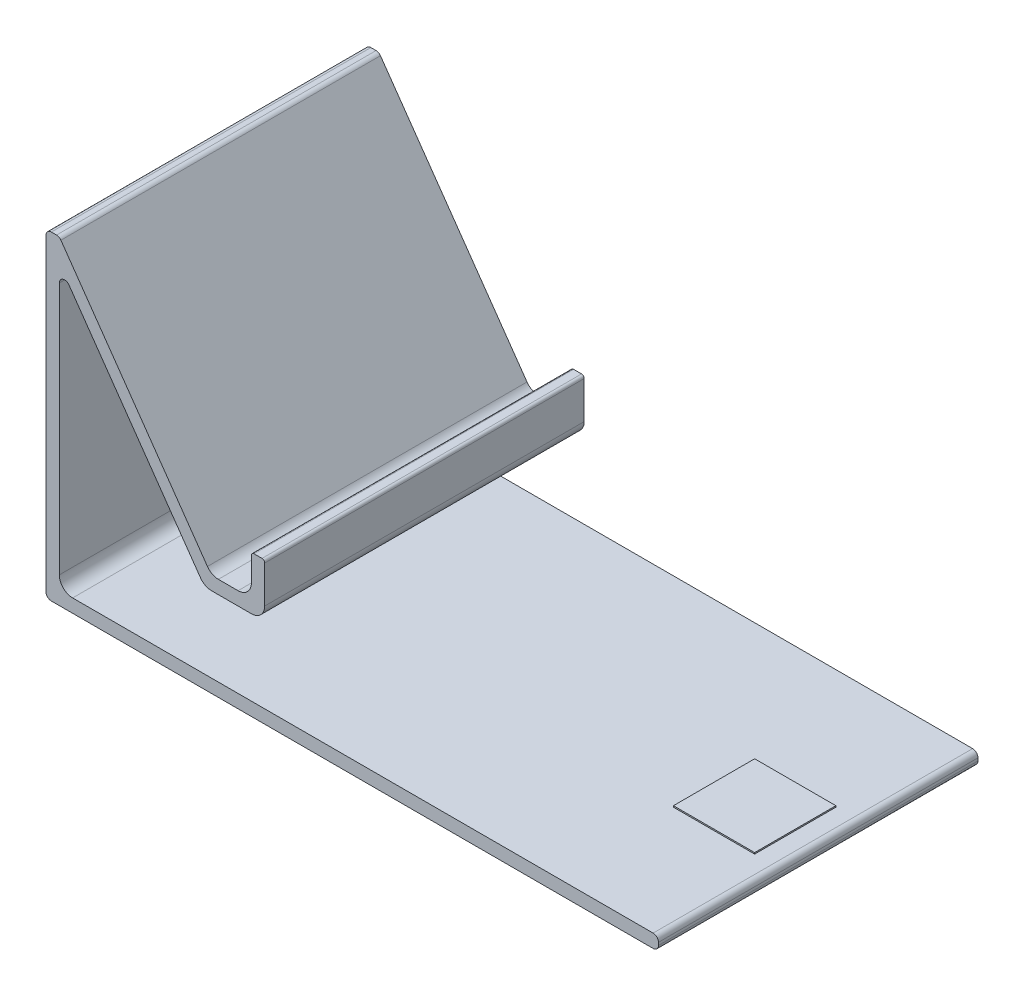
ISO-10303-21;
HEADER;
FILE_DESCRIPTION(('STEP AP214'),'2;1');
FILE_NAME('part.step','',(''),(''),'','','');
FILE_SCHEMA(('AUTOMOTIVE_DESIGN { 1 0 10303 214 1 1 1 1 }'));
ENDSEC;
DATA;
#1=APPLICATION_CONTEXT('core data for automotive mechanical design processes');
#2=APPLICATION_PROTOCOL_DEFINITION('international standard','automotive_design',2000,#1);
#3=PRODUCT_CONTEXT('',#1,'mechanical');
#4=PRODUCT('Part','Part','',(#3));
#5=PRODUCT_RELATED_PRODUCT_CATEGORY('part','',(#4));
#6=PRODUCT_DEFINITION_FORMATION('','',#4);
#7=PRODUCT_DEFINITION_CONTEXT('part definition',#1,'design');
#8=PRODUCT_DEFINITION('design','',#6,#7);
#9=PRODUCT_DEFINITION_SHAPE('','',#8);
#10=(LENGTH_UNIT() NAMED_UNIT(*) SI_UNIT(.MILLI.,.METRE.));
#11=(NAMED_UNIT(*) PLANE_ANGLE_UNIT() SI_UNIT($,.RADIAN.));
#12=(NAMED_UNIT(*) SI_UNIT($,.STERADIAN.) SOLID_ANGLE_UNIT());
#13=UNCERTAINTY_MEASURE_WITH_UNIT(LENGTH_MEASURE(1.E-05),#10,'distance_accuracy_value','');
#14=(GEOMETRIC_REPRESENTATION_CONTEXT(3) GLOBAL_UNCERTAINTY_ASSIGNED_CONTEXT((#13)) GLOBAL_UNIT_ASSIGNED_CONTEXT((#10,
#11,#12)) REPRESENTATION_CONTEXT('',''));
#15=CARTESIAN_POINT('',(0.,0.,0.));
#16=DIRECTION('',(0.,0.,1.));
#17=DIRECTION('',(1.,0.,0.));
#18=AXIS2_PLACEMENT_3D('',#15,#16,#17);
#19=CARTESIAN_POINT('',(228.,5.,120.));
#20=DIRECTION('',(0.,-1.,0.));
#21=DIRECTION('',(1.,0.,0.));
#22=AXIS2_PLACEMENT_3D('',#19,#20,#21);
#23=PLANE('',#22);
#24=DIRECTION('',(-1.,0.,0.));
#25=VECTOR('',#24,1.);
#26=CARTESIAN_POINT('',(228.,5.,0.));
#27=LINE('',#26,#25);
#28=CARTESIAN_POINT('',(228.,5.,0.));
#29=VERTEX_POINT('',#28);
#30=CARTESIAN_POINT('',(10.,4.99999999999997,0.));
#31=VERTEX_POINT('',#30);
#32=EDGE_CURVE('E339',#29,#31,#27,.T.);
#33=ORIENTED_EDGE('',*,*,#32,.T.);
#34=DIRECTION('',(0.,0.,-1.));
#35=VECTOR('',#34,1.);
#36=CARTESIAN_POINT('',(10.,4.99999999999997,120.));
#37=LINE('',#36,#35);
#38=CARTESIAN_POINT('',(10.,4.99999999999997,120.));
#39=VERTEX_POINT('',#38);
#40=EDGE_CURVE('E409',#39,#31,#37,.T.);
#41=ORIENTED_EDGE('',*,*,#40,.F.);
#42=DIRECTION('',(-1.,0.,0.));
#43=VECTOR('',#42,1.);
#44=CARTESIAN_POINT('',(228.,5.,120.));
#45=LINE('',#44,#43);
#46=CARTESIAN_POINT('',(228.,5.,120.));
#47=VERTEX_POINT('',#46);
#48=EDGE_CURVE('E284',#47,#39,#45,.T.);
#49=ORIENTED_EDGE('',*,*,#48,.F.);
#50=DIRECTION('',(0.,0.,-1.));
#51=VECTOR('',#50,1.);
#52=CARTESIAN_POINT('',(228.,5.,120.));
#53=LINE('',#52,#51);
#54=EDGE_CURVE('E412',#47,#29,#53,.T.);
#55=ORIENTED_EDGE('',*,*,#54,.T.);
#56=EDGE_LOOP('',(#33,#41,#49,#55));
#57=FACE_BOUND('',#56,.T.);
#58=DIRECTION('',(0.,0.,1.));
#59=VECTOR('',#58,1.);
#60=CARTESIAN_POINT('',(190.874109235652,4.99999999999999,120.));
#61=LINE('',#60,#59);
#62=CARTESIAN_POINT('',(190.874109235652,5.,44.75));
#63=VERTEX_POINT('',#62);
#64=CARTESIAN_POINT('',(190.874109235652,4.99999999999999,75.25));
#65=VERTEX_POINT('',#64);
#66=EDGE_CURVE('E11',#63,#65,#61,.T.);
#67=ORIENTED_EDGE('',*,*,#66,.F.);
#68=DIRECTION('',(-1.,0.,0.));
#69=VECTOR('',#68,1.);
#70=CARTESIAN_POINT('',(228.,5.,44.75));
#71=LINE('',#70,#69);
#72=CARTESIAN_POINT('',(221.374109235652,5.,44.75));
#73=VERTEX_POINT('',#72);
#74=EDGE_CURVE('E440',#73,#63,#71,.T.);
#75=ORIENTED_EDGE('',*,*,#74,.F.);
#76=DIRECTION('',(0.,0.,-1.));
#77=VECTOR('',#76,1.);
#78=CARTESIAN_POINT('',(221.374109235652,5.,120.));
#79=LINE('',#78,#77);
#80=CARTESIAN_POINT('',(221.374109235652,5.,75.25));
#81=VERTEX_POINT('',#80);
#82=EDGE_CURVE('E51',#81,#73,#79,.T.);
#83=ORIENTED_EDGE('',*,*,#82,.F.);
#84=DIRECTION('',(1.,0.,0.));
#85=VECTOR('',#84,1.);
#86=CARTESIAN_POINT('',(228.,5.,75.25));
#87=LINE('',#86,#85);
#88=EDGE_CURVE('E41',#65,#81,#87,.T.);
#89=ORIENTED_EDGE('',*,*,#88,.F.);
#90=EDGE_LOOP('',(#67,#75,#83,#89));
#91=FACE_BOUND('',#90,.T.);
#92=ADVANCED_FACE('F33',(#57,#91),#23,.F.);
#93=CARTESIAN_POINT('',(64.726944488411,43.4183172581834,120.));
#94=DIRECTION('',(0.,0.,-1.));
#95=DIRECTION('',(-1.,0.,0.));
#96=AXIS2_PLACEMENT_3D('',#93,#94,#95);
#97=CYLINDRICAL_SURFACE('',#96,5.);
#98=CARTESIAN_POINT('',(64.726944488411,43.4183172581834,0.));
#99=DIRECTION('',(0.,0.,-1.));
#100=DIRECTION('',(-1.,0.,0.));
#101=AXIS2_PLACEMENT_3D('',#98,#99,#100);
#102=CIRCLE('',#101,5.);
#103=CARTESIAN_POINT('',(64.7269444884111,38.4183172581834,0.));
#104=VERTEX_POINT('',#103);
#105=CARTESIAN_POINT('',(60.6311842669661,40.5504350764282,0.));
#106=VERTEX_POINT('',#105);
#107=EDGE_CURVE('E247',#104,#106,#102,.T.);
#108=ORIENTED_EDGE('',*,*,#107,.T.);
#109=DIRECTION('',(0.,0.,-1.));
#110=VECTOR('',#109,1.);
#111=CARTESIAN_POINT('',(60.6311842669661,40.5504350764282,120.));
#112=LINE('',#111,#110);
#113=CARTESIAN_POINT('',(60.6311842669661,40.5504350764282,120.));
#114=VERTEX_POINT('',#113);
#115=EDGE_CURVE('E437',#114,#106,#112,.T.);
#116=ORIENTED_EDGE('',*,*,#115,.F.);
#117=CARTESIAN_POINT('',(64.726944488411,43.4183172581834,120.));
#118=DIRECTION('',(0.,0.,-1.));
#119=DIRECTION('',(-1.,0.,0.));
#120=AXIS2_PLACEMENT_3D('',#117,#118,#119);
#121=CIRCLE('',#120,5.);
#122=CARTESIAN_POINT('',(64.7269444884111,38.4183172581834,120.));
#123=VERTEX_POINT('',#122);
#124=EDGE_CURVE('E256',#123,#114,#121,.T.);
#125=ORIENTED_EDGE('',*,*,#124,.F.);
#126=DIRECTION('',(0.,0.,-1.));
#127=VECTOR('',#126,1.);
#128=CARTESIAN_POINT('',(64.7269444884111,38.4183172581834,120.));
#129=LINE('',#128,#127);
#130=EDGE_CURVE('E313',#123,#104,#129,.T.);
#131=ORIENTED_EDGE('',*,*,#130,.T.);
#132=EDGE_LOOP('',(#108,#116,#125,#131));
#133=FACE_BOUND('',#132,.T.);
#134=ADVANCED_FACE('F35',(#133),#97,.F.);
#135=CARTESIAN_POINT('',(60.6311842669661,40.5504350764282,120.));
#136=DIRECTION('',(-0.819152044288995,-0.573576436351042,0.));
#137=DIRECTION('',(0.573576436351042,-0.819152044288995,0.));
#138=AXIS2_PLACEMENT_3D('',#135,#136,#137);
#139=PLANE('',#138);
#140=DIRECTION('',(-0.573576436351042,0.819152044288995,0.));
#141=VECTOR('',#140,1.);
#142=CARTESIAN_POINT('',(60.6311842669661,40.5504350764282,0.));
#143=LINE('',#142,#141);
#144=CARTESIAN_POINT('',(5.5971699874745,119.147152872702,0.));
#145=VERTEX_POINT('',#144);
#146=EDGE_CURVE('E250',#106,#145,#143,.T.);
#147=ORIENTED_EDGE('',*,*,#146,.T.);
#148=DIRECTION('',(0.,0.,-1.));
#149=VECTOR('',#148,1.);
#150=CARTESIAN_POINT('',(5.5971699874745,119.147152872702,120.));
#151=LINE('',#150,#149);
#152=CARTESIAN_POINT('',(5.5971699874745,119.147152872702,120.));
#153=VERTEX_POINT('',#152);
#154=EDGE_CURVE('E434',#153,#145,#151,.T.);
#155=ORIENTED_EDGE('',*,*,#154,.F.);
#156=DIRECTION('',(-0.573576436351042,0.819152044288995,0.));
#157=VECTOR('',#156,1.);
#158=CARTESIAN_POINT('',(60.6311842669661,40.5504350764282,120.));
#159=LINE('',#158,#157);
#160=EDGE_CURVE('E259',#114,#153,#159,.T.);
#161=ORIENTED_EDGE('',*,*,#160,.F.);
#162=ORIENTED_EDGE('',*,*,#115,.T.);
#163=EDGE_LOOP('',(#147,#155,#161,#162));
#164=FACE_BOUND('',#163,.T.);
#165=ADVANCED_FACE('F459',(#164),#139,.F.);
#166=CARTESIAN_POINT('',(3.9588658988965,118.,120.));
#167=DIRECTION('',(0.,0.,-1.));
#168=DIRECTION('',(-1.,0.,0.));
#169=AXIS2_PLACEMENT_3D('',#166,#167,#168);
#170=CYLINDRICAL_SURFACE('',#169,2.);
#171=CARTESIAN_POINT('',(3.9588658988965,118.,0.));
#172=DIRECTION('',(0.,0.,1.));
#173=DIRECTION('',(1.,0.,0.));
#174=AXIS2_PLACEMENT_3D('',#171,#172,#173);
#175=CIRCLE('',#174,2.);
#176=CARTESIAN_POINT('',(3.95886589889649,120.,0.));
#177=VERTEX_POINT('',#176);
#178=EDGE_CURVE('E316',#145,#177,#175,.T.);
#179=ORIENTED_EDGE('',*,*,#178,.T.);
#180=DIRECTION('',(0.,0.,-1.));
#181=VECTOR('',#180,1.);
#182=CARTESIAN_POINT('',(3.95886589889649,120.,120.));
#183=LINE('',#182,#181);
#184=CARTESIAN_POINT('',(3.95886589889649,120.,120.));
#185=VERTEX_POINT('',#184);
#186=EDGE_CURVE('E432',#185,#177,#183,.T.);
#187=ORIENTED_EDGE('',*,*,#186,.F.);
#188=CARTESIAN_POINT('',(3.9588658988965,118.,120.));
#189=DIRECTION('',(0.,0.,1.));
#190=DIRECTION('',(1.,0.,0.));
#191=AXIS2_PLACEMENT_3D('',#188,#189,#190);
#192=CIRCLE('',#191,2.);
#193=EDGE_CURVE('E262',#153,#185,#192,.T.);
#194=ORIENTED_EDGE('',*,*,#193,.F.);
#195=ORIENTED_EDGE('',*,*,#154,.T.);
#196=EDGE_LOOP('',(#179,#187,#194,#195));
#197=FACE_BOUND('',#196,.T.);
#198=ADVANCED_FACE('F496',(#197),#170,.T.);
#199=CARTESIAN_POINT('',(2.00000000000001,120.,120.));
#200=DIRECTION('',(0.,1.,0.));
#201=DIRECTION('',(0.,0.,1.));
#202=AXIS2_PLACEMENT_3D('',#199,#200,#201);
#203=PLANE('',#202);
#204=DIRECTION('',(1.,0.,0.));
#205=VECTOR('',#204,1.);
#206=CARTESIAN_POINT('',(2.00000000000001,120.,0.));
#207=LINE('',#206,#205);
#208=CARTESIAN_POINT('',(2.00000000000001,120.,0.));
#209=VERTEX_POINT('',#208);
#210=EDGE_CURVE('E319',#209,#177,#207,.T.);
#211=ORIENTED_EDGE('',*,*,#210,.F.);
#212=DIRECTION('',(0.,0.,-1.));
#213=VECTOR('',#212,1.);
#214=CARTESIAN_POINT('',(2.00000000000001,120.,120.));
#215=LINE('',#214,#213);
#216=CARTESIAN_POINT('',(2.00000000000001,120.,120.));
#217=VERTEX_POINT('',#216);
#218=EDGE_CURVE('E430',#217,#209,#215,.T.);
#219=ORIENTED_EDGE('',*,*,#218,.F.);
#220=DIRECTION('',(1.,0.,0.));
#221=VECTOR('',#220,1.);
#222=CARTESIAN_POINT('',(2.00000000000001,120.,120.));
#223=LINE('',#222,#221);
#224=EDGE_CURVE('E264',#217,#185,#223,.T.);
#225=ORIENTED_EDGE('',*,*,#224,.T.);
#226=ORIENTED_EDGE('',*,*,#186,.T.);
#227=EDGE_LOOP('',(#211,#219,#225,#226));
#228=FACE_BOUND('',#227,.T.);
#229=ADVANCED_FACE('F492',(#228),#203,.T.);
#230=CARTESIAN_POINT('',(2.,118.,120.));
#231=DIRECTION('',(0.,0.,-1.));
#232=DIRECTION('',(-1.,0.,0.));
#233=AXIS2_PLACEMENT_3D('',#230,#231,#232);
#234=CYLINDRICAL_SURFACE('',#233,2.);
#235=CARTESIAN_POINT('',(2.,118.,0.));
#236=DIRECTION('',(0.,0.,-1.));
#237=DIRECTION('',(-1.,0.,0.));
#238=AXIS2_PLACEMENT_3D('',#235,#236,#237);
#239=CIRCLE('',#238,2.);
#240=CARTESIAN_POINT('',(0.,118.,0.));
#241=VERTEX_POINT('',#240);
#242=EDGE_CURVE('E322',#241,#209,#239,.T.);
#243=ORIENTED_EDGE('',*,*,#242,.F.);
#244=DIRECTION('',(0.,0.,-1.));
#245=VECTOR('',#244,1.);
#246=CARTESIAN_POINT('',(0.,118.,120.));
#247=LINE('',#246,#245);
#248=CARTESIAN_POINT('',(0.,118.,120.));
#249=VERTEX_POINT('',#248);
#250=EDGE_CURVE('E428',#249,#241,#247,.T.);
#251=ORIENTED_EDGE('',*,*,#250,.F.);
#252=CARTESIAN_POINT('',(2.,118.,120.));
#253=DIRECTION('',(0.,0.,-1.));
#254=DIRECTION('',(-1.,0.,0.));
#255=AXIS2_PLACEMENT_3D('',#252,#253,#254);
#256=CIRCLE('',#255,2.);
#257=EDGE_CURVE('E267',#249,#217,#256,.T.);
#258=ORIENTED_EDGE('',*,*,#257,.T.);
#259=ORIENTED_EDGE('',*,*,#218,.T.);
#260=EDGE_LOOP('',(#243,#251,#258,#259));
#261=FACE_BOUND('',#260,.T.);
#262=ADVANCED_FACE('F488',(#261),#234,.T.);
#263=CARTESIAN_POINT('',(0.,2.00000000000001,120.));
#264=DIRECTION('',(-1.,0.,0.));
#265=DIRECTION('',(0.,0.,1.));
#266=AXIS2_PLACEMENT_3D('',#263,#264,#265);
#267=PLANE('',#266);
#268=DIRECTION('',(0.,1.,0.));
#269=VECTOR('',#268,1.);
#270=CARTESIAN_POINT('',(0.,2.00000000000001,0.));
#271=LINE('',#270,#269);
#272=CARTESIAN_POINT('',(0.,2.00000000000001,0.));
#273=VERTEX_POINT('',#272);
#274=EDGE_CURVE('E325',#273,#241,#271,.T.);
#275=ORIENTED_EDGE('',*,*,#274,.F.);
#276=DIRECTION('',(0.,0.,-1.));
#277=VECTOR('',#276,1.);
#278=CARTESIAN_POINT('',(0.,2.00000000000001,120.));
#279=LINE('',#278,#277);
#280=CARTESIAN_POINT('',(0.,2.00000000000001,120.));
#281=VERTEX_POINT('',#280);
#282=EDGE_CURVE('E426',#281,#273,#279,.T.);
#283=ORIENTED_EDGE('',*,*,#282,.F.);
#284=DIRECTION('',(0.,1.,0.));
#285=VECTOR('',#284,1.);
#286=CARTESIAN_POINT('',(0.,2.00000000000001,120.));
#287=LINE('',#286,#285);
#288=EDGE_CURVE('E270',#281,#249,#287,.T.);
#289=ORIENTED_EDGE('',*,*,#288,.T.);
#290=ORIENTED_EDGE('',*,*,#250,.T.);
#291=EDGE_LOOP('',(#275,#283,#289,#290));
#292=FACE_BOUND('',#291,.T.);
#293=ADVANCED_FACE('F484',(#292),#267,.T.);
#294=CARTESIAN_POINT('',(2.,2.,120.));
#295=DIRECTION('',(0.,0.,-1.));
#296=DIRECTION('',(-1.,0.,0.));
#297=AXIS2_PLACEMENT_3D('',#294,#295,#296);
#298=CYLINDRICAL_SURFACE('',#297,2.);
#299=CARTESIAN_POINT('',(2.,2.,0.));
#300=DIRECTION('',(0.,0.,-1.));
#301=DIRECTION('',(-1.,0.,0.));
#302=AXIS2_PLACEMENT_3D('',#299,#300,#301);
#303=CIRCLE('',#302,2.);
#304=CARTESIAN_POINT('',(2.00000000000001,0.,0.));
#305=VERTEX_POINT('',#304);
#306=EDGE_CURVE('E328',#305,#273,#303,.T.);
#307=ORIENTED_EDGE('',*,*,#306,.F.);
#308=DIRECTION('',(0.,0.,-1.));
#309=VECTOR('',#308,1.);
#310=CARTESIAN_POINT('',(2.00000000000001,0.,120.));
#311=LINE('',#310,#309);
#312=CARTESIAN_POINT('',(2.00000000000001,0.,120.));
#313=VERTEX_POINT('',#312);
#314=EDGE_CURVE('E424',#313,#305,#311,.T.);
#315=ORIENTED_EDGE('',*,*,#314,.F.);
#316=CARTESIAN_POINT('',(2.,2.,120.));
#317=DIRECTION('',(0.,0.,-1.));
#318=DIRECTION('',(-1.,0.,0.));
#319=AXIS2_PLACEMENT_3D('',#316,#317,#318);
#320=CIRCLE('',#319,2.);
#321=EDGE_CURVE('E273',#313,#281,#320,.T.);
#322=ORIENTED_EDGE('',*,*,#321,.T.);
#323=ORIENTED_EDGE('',*,*,#282,.T.);
#324=EDGE_LOOP('',(#307,#315,#322,#323));
#325=FACE_BOUND('',#324,.T.);
#326=ADVANCED_FACE('F480',(#325),#298,.T.);
#327=CARTESIAN_POINT('',(2.00000000000001,0.,120.));
#328=DIRECTION('',(0.,1.,0.));
#329=DIRECTION('',(0.,0.,1.));
#330=AXIS2_PLACEMENT_3D('',#327,#328,#329);
#331=PLANE('',#330);
#332=DIRECTION('',(1.,0.,0.));
#333=VECTOR('',#332,1.);
#334=CARTESIAN_POINT('',(2.00000000000001,0.,0.));
#335=LINE('',#334,#333);
#336=CARTESIAN_POINT('',(228.,0.,0.));
#337=VERTEX_POINT('',#336);
#338=EDGE_CURVE('E331',#305,#337,#335,.T.);
#339=ORIENTED_EDGE('',*,*,#338,.T.);
#340=DIRECTION('',(0.,0.,-1.));
#341=VECTOR('',#340,1.);
#342=CARTESIAN_POINT('',(228.,0.,120.));
#343=LINE('',#342,#341);
#344=CARTESIAN_POINT('',(228.,0.,120.));
#345=VERTEX_POINT('',#344);
#346=EDGE_CURVE('E421',#345,#337,#343,.T.);
#347=ORIENTED_EDGE('',*,*,#346,.F.);
#348=DIRECTION('',(1.,0.,0.));
#349=VECTOR('',#348,1.);
#350=CARTESIAN_POINT('',(2.00000000000001,0.,120.));
#351=LINE('',#350,#349);
#352=EDGE_CURVE('E276',#313,#345,#351,.T.);
#353=ORIENTED_EDGE('',*,*,#352,.F.);
#354=ORIENTED_EDGE('',*,*,#314,.T.);
#355=EDGE_LOOP('',(#339,#347,#353,#354));
#356=FACE_BOUND('',#355,.T.);
#357=ADVANCED_FACE('F476',(#356),#331,.F.);
#358=CARTESIAN_POINT('',(228.,2.,120.));
#359=DIRECTION('',(0.,0.,-1.));
#360=DIRECTION('',(-1.,0.,0.));
#361=AXIS2_PLACEMENT_3D('',#358,#359,#360);
#362=CYLINDRICAL_SURFACE('',#361,2.);
#363=CARTESIAN_POINT('',(228.,2.,0.));
#364=DIRECTION('',(0.,0.,1.));
#365=DIRECTION('',(1.,0.,0.));
#366=AXIS2_PLACEMENT_3D('',#363,#364,#365);
#367=CIRCLE('',#366,2.);
#368=CARTESIAN_POINT('',(230.,2.,0.));
#369=VERTEX_POINT('',#368);
#370=EDGE_CURVE('E333',#337,#369,#367,.T.);
#371=ORIENTED_EDGE('',*,*,#370,.T.);
#372=DIRECTION('',(0.,0.,-1.));
#373=VECTOR('',#372,1.);
#374=CARTESIAN_POINT('',(230.,2.,120.));
#375=LINE('',#374,#373);
#376=CARTESIAN_POINT('',(230.,2.,120.));
#377=VERTEX_POINT('',#376);
#378=EDGE_CURVE('E418',#377,#369,#375,.T.);
#379=ORIENTED_EDGE('',*,*,#378,.F.);
#380=CARTESIAN_POINT('',(228.,2.,120.));
#381=DIRECTION('',(0.,0.,1.));
#382=DIRECTION('',(1.,0.,0.));
#383=AXIS2_PLACEMENT_3D('',#380,#381,#382);
#384=CIRCLE('',#383,2.);
#385=EDGE_CURVE('E278',#345,#377,#384,.T.);
#386=ORIENTED_EDGE('',*,*,#385,.F.);
#387=ORIENTED_EDGE('',*,*,#346,.T.);
#388=EDGE_LOOP('',(#371,#379,#386,#387));
#389=FACE_BOUND('',#388,.T.);
#390=ADVANCED_FACE('F472',(#389),#362,.T.);
#391=CARTESIAN_POINT('',(230.,2.,120.));
#392=DIRECTION('',(-1.,0.,0.));
#393=DIRECTION('',(0.,0.,1.));
#394=AXIS2_PLACEMENT_3D('',#391,#392,#393);
#395=PLANE('',#394);
#396=DIRECTION('',(0.,1.,0.));
#397=VECTOR('',#396,1.);
#398=CARTESIAN_POINT('',(230.,2.,0.));
#399=LINE('',#398,#397);
#400=CARTESIAN_POINT('',(230.,3.,0.));
#401=VERTEX_POINT('',#400);
#402=EDGE_CURVE('E335',#369,#401,#399,.T.);
#403=ORIENTED_EDGE('',*,*,#402,.T.);
#404=DIRECTION('',(0.,0.,-1.));
#405=VECTOR('',#404,1.);
#406=CARTESIAN_POINT('',(230.,3.,120.));
#407=LINE('',#406,#405);
#408=CARTESIAN_POINT('',(230.,3.,120.));
#409=VERTEX_POINT('',#408);
#410=EDGE_CURVE('E415',#409,#401,#407,.T.);
#411=ORIENTED_EDGE('',*,*,#410,.F.);
#412=DIRECTION('',(0.,1.,0.));
#413=VECTOR('',#412,1.);
#414=CARTESIAN_POINT('',(230.,2.,120.));
#415=LINE('',#414,#413);
#416=EDGE_CURVE('E280',#377,#409,#415,.T.);
#417=ORIENTED_EDGE('',*,*,#416,.F.);
#418=ORIENTED_EDGE('',*,*,#378,.T.);
#419=EDGE_LOOP('',(#403,#411,#417,#418));
#420=FACE_BOUND('',#419,.T.);
#421=ADVANCED_FACE('F468',(#420),#395,.F.);
#422=CARTESIAN_POINT('',(228.,3.,120.));
#423=DIRECTION('',(0.,0.,-1.));
#424=DIRECTION('',(-1.,0.,0.));
#425=AXIS2_PLACEMENT_3D('',#422,#423,#424);
#426=CYLINDRICAL_SURFACE('',#425,2.);
#427=CARTESIAN_POINT('',(228.,3.,0.));
#428=DIRECTION('',(0.,0.,1.));
#429=DIRECTION('',(1.,0.,0.));
#430=AXIS2_PLACEMENT_3D('',#427,#428,#429);
#431=CIRCLE('',#430,2.);
#432=EDGE_CURVE('E337',#401,#29,#431,.T.);
#433=ORIENTED_EDGE('',*,*,#432,.T.);
#434=ORIENTED_EDGE('',*,*,#54,.F.);
#435=CARTESIAN_POINT('',(228.,3.,120.));
#436=DIRECTION('',(0.,0.,1.));
#437=DIRECTION('',(1.,0.,0.));
#438=AXIS2_PLACEMENT_3D('',#435,#436,#437);
#439=CIRCLE('',#438,2.);
#440=EDGE_CURVE('E282',#409,#47,#439,.T.);
#441=ORIENTED_EDGE('',*,*,#440,.F.);
#442=ORIENTED_EDGE('',*,*,#410,.T.);
#443=EDGE_LOOP('',(#433,#434,#441,#442));
#444=FACE_BOUND('',#443,.T.);
#445=ADVANCED_FACE('F465',(#444),#426,.T.);
#446=CARTESIAN_POINT('',(10.,9.99999999999997,120.));
#447=DIRECTION('',(0.,0.,-1.));
#448=DIRECTION('',(-1.,0.,0.));
#449=AXIS2_PLACEMENT_3D('',#446,#447,#448);
#450=CYLINDRICAL_SURFACE('',#449,5.);
#451=CARTESIAN_POINT('',(10.,9.99999999999997,0.));
#452=DIRECTION('',(0.,0.,-1.));
#453=DIRECTION('',(-1.,0.,0.));
#454=AXIS2_PLACEMENT_3D('',#451,#452,#453);
#455=CIRCLE('',#454,5.);
#456=CARTESIAN_POINT('',(5.,9.99999999999997,0.));
#457=VERTEX_POINT('',#456);
#458=EDGE_CURVE('E341',#31,#457,#455,.T.);
#459=ORIENTED_EDGE('',*,*,#458,.T.);
#460=DIRECTION('',(0.,0.,-1.));
#461=VECTOR('',#460,1.);
#462=CARTESIAN_POINT('',(5.,9.99999999999997,120.));
#463=LINE('',#462,#461);
#464=CARTESIAN_POINT('',(5.,9.99999999999997,120.));
#465=VERTEX_POINT('',#464);
#466=EDGE_CURVE('E406',#465,#457,#463,.T.);
#467=ORIENTED_EDGE('',*,*,#466,.F.);
#468=CARTESIAN_POINT('',(10.,9.99999999999997,120.));
#469=DIRECTION('',(0.,0.,-1.));
#470=DIRECTION('',(-1.,0.,0.));
#471=AXIS2_PLACEMENT_3D('',#468,#469,#470);
#472=CIRCLE('',#471,5.);
#473=EDGE_CURVE('E286',#39,#465,#472,.T.);
#474=ORIENTED_EDGE('',*,*,#473,.F.);
#475=ORIENTED_EDGE('',*,*,#40,.T.);
#476=EDGE_LOOP('',(#459,#467,#474,#475));
#477=FACE_BOUND('',#476,.T.);
#478=ADVANCED_FACE('F463',(#477),#450,.F.);
#479=CARTESIAN_POINT('',(5.,10.,120.));
#480=DIRECTION('',(-1.,0.,0.));
#481=DIRECTION('',(0.,-1.,0.));
#482=AXIS2_PLACEMENT_3D('',#479,#480,#481);
#483=PLANE('',#482);
#484=DIRECTION('',(0.,1.,0.));
#485=VECTOR('',#484,1.);
#486=CARTESIAN_POINT('',(5.,10.,0.));
#487=LINE('',#486,#485);
#488=CARTESIAN_POINT('',(5.,104.939576417168,0.));
#489=VERTEX_POINT('',#488);
#490=EDGE_CURVE('E343',#457,#489,#487,.T.);
#491=ORIENTED_EDGE('',*,*,#490,.T.);
#492=DIRECTION('',(0.,0.,-1.));
#493=VECTOR('',#492,1.);
#494=CARTESIAN_POINT('',(5.,104.939576417168,120.));
#495=LINE('',#494,#493);
#496=CARTESIAN_POINT('',(5.,104.939576417168,120.));
#497=VERTEX_POINT('',#496);
#498=EDGE_CURVE('E403',#497,#489,#495,.T.);
#499=ORIENTED_EDGE('',*,*,#498,.F.);
#500=DIRECTION('',(0.,1.,0.));
#501=VECTOR('',#500,1.);
#502=CARTESIAN_POINT('',(5.,10.,120.));
#503=LINE('',#502,#501);
#504=EDGE_CURVE('E288',#465,#497,#503,.T.);
#505=ORIENTED_EDGE('',*,*,#504,.F.);
#506=ORIENTED_EDGE('',*,*,#466,.T.);
#507=EDGE_LOOP('',(#491,#499,#505,#506));
#508=FACE_BOUND('',#507,.T.);
#509=ADVANCED_FACE('F545',(#508),#483,.F.);
#510=CARTESIAN_POINT('',(7.,104.939576417168,120.));
#511=DIRECTION('',(0.,0.,-1.));
#512=DIRECTION('',(-1.,0.,0.));
#513=AXIS2_PLACEMENT_3D('',#510,#511,#512);
#514=CYLINDRICAL_SURFACE('',#513,2.);
#515=CARTESIAN_POINT('',(7.,104.939576417168,0.));
#516=DIRECTION('',(0.,0.,-1.));
#517=DIRECTION('',(-1.,0.,0.));
#518=AXIS2_PLACEMENT_3D('',#515,#516,#517);
#519=CIRCLE('',#518,2.);
#520=CARTESIAN_POINT('',(8.63830408857804,106.08672928987,0.));
#521=VERTEX_POINT('',#520);
#522=EDGE_CURVE('E345',#489,#521,#519,.T.);
#523=ORIENTED_EDGE('',*,*,#522,.T.);
#524=DIRECTION('',(0.,0.,-1.));
#525=VECTOR('',#524,1.);
#526=CARTESIAN_POINT('',(8.63830408857804,106.08672928987,120.));
#527=LINE('',#526,#525);
#528=CARTESIAN_POINT('',(8.63830408857804,106.08672928987,120.));
#529=VERTEX_POINT('',#528);
#530=EDGE_CURVE('E400',#529,#521,#527,.T.);
#531=ORIENTED_EDGE('',*,*,#530,.F.);
#532=CARTESIAN_POINT('',(7.,104.939576417168,120.));
#533=DIRECTION('',(0.,0.,-1.));
#534=DIRECTION('',(-1.,0.,0.));
#535=AXIS2_PLACEMENT_3D('',#532,#533,#534);
#536=CIRCLE('',#535,2.);
#537=EDGE_CURVE('E290',#497,#529,#536,.T.);
#538=ORIENTED_EDGE('',*,*,#537,.F.);
#539=ORIENTED_EDGE('',*,*,#498,.T.);
#540=EDGE_LOOP('',(#523,#531,#538,#539));
#541=FACE_BOUND('',#540,.T.);
#542=ADVANCED_FACE('F551',(#541),#514,.F.);
#543=CARTESIAN_POINT('',(8.63830408857804,106.08672928987,120.));
#544=DIRECTION('',(0.819152044288995,0.573576436351041,0.));
#545=DIRECTION('',(-0.573576436351042,0.819152044288995,0.));
#546=AXIS2_PLACEMENT_3D('',#543,#544,#545);
#547=PLANE('',#546);
#548=DIRECTION('',(0.573576436351041,-0.819152044288995,0.));
#549=VECTOR('',#548,1.);
#550=CARTESIAN_POINT('',(8.63830408857804,106.08672928987,0.));
#551=LINE('',#550,#549);
#552=CARTESIAN_POINT('',(58.0283490142073,35.5504350764282,0.));
#553=VERTEX_POINT('',#552);
#554=EDGE_CURVE('E347',#521,#553,#551,.T.);
#555=ORIENTED_EDGE('',*,*,#554,.T.);
#556=DIRECTION('',(0.,0.,-1.));
#557=VECTOR('',#556,1.);
#558=CARTESIAN_POINT('',(58.0283490142073,35.5504350764282,120.));
#559=LINE('',#558,#557);
#560=CARTESIAN_POINT('',(58.0283490142073,35.5504350764282,120.));
#561=VERTEX_POINT('',#560);
#562=EDGE_CURVE('E397',#561,#553,#559,.T.);
#563=ORIENTED_EDGE('',*,*,#562,.F.);
#564=DIRECTION('',(0.573576436351041,-0.819152044288995,0.));
#565=VECTOR('',#564,1.);
#566=CARTESIAN_POINT('',(8.63830408857804,106.08672928987,120.));
#567=LINE('',#566,#565);
#568=EDGE_CURVE('E292',#529,#561,#567,.T.);
#569=ORIENTED_EDGE('',*,*,#568,.F.);
#570=ORIENTED_EDGE('',*,*,#530,.T.);
#571=EDGE_LOOP('',(#555,#563,#569,#570));
#572=FACE_BOUND('',#571,.T.);
#573=ADVANCED_FACE('F555',(#572),#547,.F.);
#574=CARTESIAN_POINT('',(62.1241092356523,38.4183172581834,120.));
#575=DIRECTION('',(0.,0.,-1.));
#576=DIRECTION('',(-1.,0.,0.));
#577=AXIS2_PLACEMENT_3D('',#574,#575,#576);
#578=CYLINDRICAL_SURFACE('',#577,5.);
#579=CARTESIAN_POINT('',(62.1241092356523,38.4183172581834,0.));
#580=DIRECTION('',(0.,0.,1.));
#581=DIRECTION('',(1.,0.,0.));
#582=AXIS2_PLACEMENT_3D('',#579,#580,#581);
#583=CIRCLE('',#582,5.);
#584=CARTESIAN_POINT('',(62.1241092356523,33.4183172581834,0.));
#585=VERTEX_POINT('',#584);
#586=EDGE_CURVE('E349',#553,#585,#583,.T.);
#587=ORIENTED_EDGE('',*,*,#586,.T.);
#588=DIRECTION('',(0.,0.,-1.));
#589=VECTOR('',#588,1.);
#590=CARTESIAN_POINT('',(62.1241092356523,33.4183172581834,120.));
#591=LINE('',#590,#589);
#592=CARTESIAN_POINT('',(62.1241092356523,33.4183172581834,120.));
#593=VERTEX_POINT('',#592);
#594=EDGE_CURVE('E394',#593,#585,#591,.T.);
#595=ORIENTED_EDGE('',*,*,#594,.F.);
#596=CARTESIAN_POINT('',(62.1241092356523,38.4183172581834,120.));
#597=DIRECTION('',(0.,0.,1.));
#598=DIRECTION('',(1.,0.,0.));
#599=AXIS2_PLACEMENT_3D('',#596,#597,#598);
#600=CIRCLE('',#599,5.);
#601=EDGE_CURVE('E294',#561,#593,#600,.T.);
#602=ORIENTED_EDGE('',*,*,#601,.F.);
#603=ORIENTED_EDGE('',*,*,#562,.T.);
#604=EDGE_LOOP('',(#587,#595,#602,#603));
#605=FACE_BOUND('',#604,.T.);
#606=ADVANCED_FACE('F560',(#605),#578,.T.);
#607=CARTESIAN_POINT('',(62.1241092356523,33.4183172581834,120.));
#608=DIRECTION('',(0.,1.,0.));
#609=DIRECTION('',(-1.,0.,0.));
#610=AXIS2_PLACEMENT_3D('',#607,#608,#609);
#611=PLANE('',#610);
#612=DIRECTION('',(1.,0.,0.));
#613=VECTOR('',#612,1.);
#614=CARTESIAN_POINT('',(62.1241092356523,33.4183172581834,0.));
#615=LINE('',#614,#613);
#616=CARTESIAN_POINT('',(77.1241092356523,33.4183172581834,0.));
#617=VERTEX_POINT('',#616);
#618=EDGE_CURVE('E351',#585,#617,#615,.T.);
#619=ORIENTED_EDGE('',*,*,#618,.T.);
#620=DIRECTION('',(0.,0.,-1.));
#621=VECTOR('',#620,1.);
#622=CARTESIAN_POINT('',(77.1241092356523,33.4183172581834,120.));
#623=LINE('',#622,#621);
#624=CARTESIAN_POINT('',(77.1241092356523,33.4183172581834,120.));
#625=VERTEX_POINT('',#624);
#626=EDGE_CURVE('E391',#625,#617,#623,.T.);
#627=ORIENTED_EDGE('',*,*,#626,.F.);
#628=DIRECTION('',(1.,0.,0.));
#629=VECTOR('',#628,1.);
#630=CARTESIAN_POINT('',(62.1241092356523,33.4183172581834,120.));
#631=LINE('',#630,#629);
#632=EDGE_CURVE('E296',#593,#625,#631,.T.);
#633=ORIENTED_EDGE('',*,*,#632,.F.);
#634=ORIENTED_EDGE('',*,*,#594,.T.);
#635=EDGE_LOOP('',(#619,#627,#633,#634));
#636=FACE_BOUND('',#635,.T.);
#637=ADVANCED_FACE('F566',(#636),#611,.F.);
#638=CARTESIAN_POINT('',(77.1241092356523,38.4183172581834,120.));
#639=DIRECTION('',(0.,0.,-1.));
#640=DIRECTION('',(-1.,0.,0.));
#641=AXIS2_PLACEMENT_3D('',#638,#639,#640);
#642=CYLINDRICAL_SURFACE('',#641,5.);
#643=CARTESIAN_POINT('',(77.1241092356523,38.4183172581834,0.));
#644=DIRECTION('',(0.,0.,1.));
#645=DIRECTION('',(1.,0.,0.));
#646=AXIS2_PLACEMENT_3D('',#643,#644,#645);
#647=CIRCLE('',#646,5.);
#648=CARTESIAN_POINT('',(82.1241092356523,38.4183172581834,0.));
#649=VERTEX_POINT('',#648);
#650=EDGE_CURVE('E353',#617,#649,#647,.T.);
#651=ORIENTED_EDGE('',*,*,#650,.T.);
#652=DIRECTION('',(0.,0.,-1.));
#653=VECTOR('',#652,1.);
#654=CARTESIAN_POINT('',(82.1241092356523,38.4183172581834,120.));
#655=LINE('',#654,#653);
#656=CARTESIAN_POINT('',(82.1241092356523,38.4183172581834,120.));
#657=VERTEX_POINT('',#656);
#658=EDGE_CURVE('E388',#657,#649,#655,.T.);
#659=ORIENTED_EDGE('',*,*,#658,.F.);
#660=CARTESIAN_POINT('',(77.1241092356523,38.4183172581834,120.));
#661=DIRECTION('',(0.,0.,1.));
#662=DIRECTION('',(1.,0.,0.));
#663=AXIS2_PLACEMENT_3D('',#660,#661,#662);
#664=CIRCLE('',#663,5.);
#665=EDGE_CURVE('E298',#625,#657,#664,.T.);
#666=ORIENTED_EDGE('',*,*,#665,.F.);
#667=ORIENTED_EDGE('',*,*,#626,.T.);
#668=EDGE_LOOP('',(#651,#659,#666,#667));
#669=FACE_BOUND('',#668,.T.);
#670=ADVANCED_FACE('F570',(#669),#642,.T.);
#671=CARTESIAN_POINT('',(82.1241092356523,38.4183172581835,120.));
#672=DIRECTION('',(-1.,0.,0.));
#673=DIRECTION('',(0.,0.,1.));
#674=AXIS2_PLACEMENT_3D('',#671,#672,#673);
#675=PLANE('',#674);
#676=DIRECTION('',(0.,1.,0.));
#677=VECTOR('',#676,1.);
#678=CARTESIAN_POINT('',(82.1241092356523,38.4183172581835,0.));
#679=LINE('',#678,#677);
#680=CARTESIAN_POINT('',(82.1241092356523,52.4183172581834,0.));
#681=VERTEX_POINT('',#680);
#682=EDGE_CURVE('E355',#649,#681,#679,.T.);
#683=ORIENTED_EDGE('',*,*,#682,.T.);
#684=DIRECTION('',(0.,0.,-1.));
#685=VECTOR('',#684,1.);
#686=CARTESIAN_POINT('',(82.1241092356523,52.4183172581834,120.));
#687=LINE('',#686,#685);
#688=CARTESIAN_POINT('',(82.1241092356523,52.4183172581834,120.));
#689=VERTEX_POINT('',#688);
#690=EDGE_CURVE('E385',#689,#681,#687,.T.);
#691=ORIENTED_EDGE('',*,*,#690,.F.);
#692=DIRECTION('',(0.,1.,0.));
#693=VECTOR('',#692,1.);
#694=CARTESIAN_POINT('',(82.1241092356523,38.4183172581835,120.));
#695=LINE('',#694,#693);
#696=EDGE_CURVE('E300',#657,#689,#695,.T.);
#697=ORIENTED_EDGE('',*,*,#696,.F.);
#698=ORIENTED_EDGE('',*,*,#658,.T.);
#699=EDGE_LOOP('',(#683,#691,#697,#698));
#700=FACE_BOUND('',#699,.T.);
#701=ADVANCED_FACE('F575',(#700),#675,.F.);
#702=CARTESIAN_POINT('',(81.1241092356523,52.4183172581834,120.));
#703=DIRECTION('',(0.,0.,-1.));
#704=DIRECTION('',(-1.,0.,0.));
#705=AXIS2_PLACEMENT_3D('',#702,#703,#704);
#706=CYLINDRICAL_SURFACE('',#705,1.);
#707=CARTESIAN_POINT('',(81.1241092356523,52.4183172581834,0.));
#708=DIRECTION('',(0.,0.,1.));
#709=DIRECTION('',(1.,0.,0.));
#710=AXIS2_PLACEMENT_3D('',#707,#708,#709);
#711=CIRCLE('',#710,1.);
#712=CARTESIAN_POINT('',(81.1241092356523,53.4183172581834,0.));
#713=VERTEX_POINT('',#712);
#714=EDGE_CURVE('E357',#681,#713,#711,.T.);
#715=ORIENTED_EDGE('',*,*,#714,.T.);
#716=DIRECTION('',(0.,0.,-1.));
#717=VECTOR('',#716,1.);
#718=CARTESIAN_POINT('',(81.1241092356523,53.4183172581834,120.));
#719=LINE('',#718,#717);
#720=CARTESIAN_POINT('',(81.1241092356523,53.4183172581834,120.));
#721=VERTEX_POINT('',#720);
#722=EDGE_CURVE('E382',#721,#713,#719,.T.);
#723=ORIENTED_EDGE('',*,*,#722,.F.);
#724=CARTESIAN_POINT('',(81.1241092356523,52.4183172581834,120.));
#725=DIRECTION('',(0.,0.,1.));
#726=DIRECTION('',(1.,0.,0.));
#727=AXIS2_PLACEMENT_3D('',#724,#725,#726);
#728=CIRCLE('',#727,1.);
#729=EDGE_CURVE('E302',#689,#721,#728,.T.);
#730=ORIENTED_EDGE('',*,*,#729,.F.);
#731=ORIENTED_EDGE('',*,*,#690,.T.);
#732=EDGE_LOOP('',(#715,#723,#730,#731));
#733=FACE_BOUND('',#732,.T.);
#734=ADVANCED_FACE('F581',(#733),#706,.T.);
#735=CARTESIAN_POINT('',(81.1241092356523,53.4183172581834,120.));
#736=DIRECTION('',(0.,-1.,0.));
#737=DIRECTION('',(0.,0.,-1.));
#738=AXIS2_PLACEMENT_3D('',#735,#736,#737);
#739=PLANE('',#738);
#740=DIRECTION('',(-1.,0.,0.));
#741=VECTOR('',#740,1.);
#742=CARTESIAN_POINT('',(81.1241092356523,53.4183172581834,0.));
#743=LINE('',#742,#741);
#744=CARTESIAN_POINT('',(78.1241092356523,53.4183172581834,0.));
#745=VERTEX_POINT('',#744);
#746=EDGE_CURVE('E359',#713,#745,#743,.T.);
#747=ORIENTED_EDGE('',*,*,#746,.T.);
#748=DIRECTION('',(0.,0.,-1.));
#749=VECTOR('',#748,1.);
#750=CARTESIAN_POINT('',(78.1241092356523,53.4183172581834,120.));
#751=LINE('',#750,#749);
#752=CARTESIAN_POINT('',(78.1241092356523,53.4183172581834,120.));
#753=VERTEX_POINT('',#752);
#754=EDGE_CURVE('E379',#753,#745,#751,.T.);
#755=ORIENTED_EDGE('',*,*,#754,.F.);
#756=DIRECTION('',(-1.,0.,0.));
#757=VECTOR('',#756,1.);
#758=CARTESIAN_POINT('',(81.1241092356523,53.4183172581834,120.));
#759=LINE('',#758,#757);
#760=EDGE_CURVE('E304',#721,#753,#759,.T.);
#761=ORIENTED_EDGE('',*,*,#760,.F.);
#762=ORIENTED_EDGE('',*,*,#722,.T.);
#763=EDGE_LOOP('',(#747,#755,#761,#762));
#764=FACE_BOUND('',#763,.T.);
#765=ADVANCED_FACE('F585',(#764),#739,.F.);
#766=CARTESIAN_POINT('',(78.1241092356523,52.4183172581834,120.));
#767=DIRECTION('',(0.,0.,-1.));
#768=DIRECTION('',(-1.,0.,0.));
#769=AXIS2_PLACEMENT_3D('',#766,#767,#768);
#770=CYLINDRICAL_SURFACE('',#769,1.);
#771=CARTESIAN_POINT('',(78.1241092356523,52.4183172581834,0.));
#772=DIRECTION('',(0.,0.,1.));
#773=DIRECTION('',(1.,0.,0.));
#774=AXIS2_PLACEMENT_3D('',#771,#772,#773);
#775=CIRCLE('',#774,1.);
#776=CARTESIAN_POINT('',(77.1241092356523,52.4183172581834,0.));
#777=VERTEX_POINT('',#776);
#778=EDGE_CURVE('E361',#745,#777,#775,.T.);
#779=ORIENTED_EDGE('',*,*,#778,.T.);
#780=DIRECTION('',(0.,0.,-1.));
#781=VECTOR('',#780,1.);
#782=CARTESIAN_POINT('',(77.1241092356523,52.4183172581834,120.));
#783=LINE('',#782,#781);
#784=CARTESIAN_POINT('',(77.1241092356523,52.4183172581834,120.));
#785=VERTEX_POINT('',#784);
#786=EDGE_CURVE('E376',#785,#777,#783,.T.);
#787=ORIENTED_EDGE('',*,*,#786,.F.);
#788=CARTESIAN_POINT('',(78.1241092356523,52.4183172581834,120.));
#789=DIRECTION('',(0.,0.,1.));
#790=DIRECTION('',(1.,0.,0.));
#791=AXIS2_PLACEMENT_3D('',#788,#789,#790);
#792=CIRCLE('',#791,1.);
#793=EDGE_CURVE('E306',#753,#785,#792,.T.);
#794=ORIENTED_EDGE('',*,*,#793,.F.);
#795=ORIENTED_EDGE('',*,*,#754,.T.);
#796=EDGE_LOOP('',(#779,#787,#794,#795));
#797=FACE_BOUND('',#796,.T.);
#798=ADVANCED_FACE('F590',(#797),#770,.T.);
#799=CARTESIAN_POINT('',(77.1241092356523,52.4183172581834,120.));
#800=DIRECTION('',(1.,0.,0.));
#801=DIRECTION('',(0.,1.,0.));
#802=AXIS2_PLACEMENT_3D('',#799,#800,#801);
#803=PLANE('',#802);
#804=DIRECTION('',(0.,-1.,0.));
#805=VECTOR('',#804,1.);
#806=CARTESIAN_POINT('',(77.1241092356523,52.4183172581834,0.));
#807=LINE('',#806,#805);
#808=CARTESIAN_POINT('',(77.1241092356523,43.4183172581835,0.));
#809=VERTEX_POINT('',#808);
#810=EDGE_CURVE('E363',#777,#809,#807,.T.);
#811=ORIENTED_EDGE('',*,*,#810,.T.);
#812=DIRECTION('',(0.,0.,-1.));
#813=VECTOR('',#812,1.);
#814=CARTESIAN_POINT('',(77.1241092356523,43.4183172581835,120.));
#815=LINE('',#814,#813);
#816=CARTESIAN_POINT('',(77.1241092356523,43.4183172581835,120.));
#817=VERTEX_POINT('',#816);
#818=EDGE_CURVE('E373',#817,#809,#815,.T.);
#819=ORIENTED_EDGE('',*,*,#818,.F.);
#820=DIRECTION('',(0.,-1.,0.));
#821=VECTOR('',#820,1.);
#822=CARTESIAN_POINT('',(77.1241092356523,52.4183172581834,120.));
#823=LINE('',#822,#821);
#824=EDGE_CURVE('E308',#785,#817,#823,.T.);
#825=ORIENTED_EDGE('',*,*,#824,.F.);
#826=ORIENTED_EDGE('',*,*,#786,.T.);
#827=EDGE_LOOP('',(#811,#819,#825,#826));
#828=FACE_BOUND('',#827,.T.);
#829=ADVANCED_FACE('F596',(#828),#803,.F.);
#830=CARTESIAN_POINT('',(72.1241092356523,43.4183172581834,120.));
#831=DIRECTION('',(0.,0.,-1.));
#832=DIRECTION('',(-1.,0.,0.));
#833=AXIS2_PLACEMENT_3D('',#830,#831,#832);
#834=CYLINDRICAL_SURFACE('',#833,4.99999999999999);
#835=CARTESIAN_POINT('',(72.1241092356523,43.4183172581834,0.));
#836=DIRECTION('',(0.,0.,-1.));
#837=DIRECTION('',(-1.,0.,0.));
#838=AXIS2_PLACEMENT_3D('',#835,#836,#837);
#839=CIRCLE('',#838,4.99999999999999);
#840=CARTESIAN_POINT('',(72.1241092356523,38.4183172581834,0.));
#841=VERTEX_POINT('',#840);
#842=EDGE_CURVE('E365',#809,#841,#839,.T.);
#843=ORIENTED_EDGE('',*,*,#842,.T.);
#844=DIRECTION('',(0.,0.,-1.));
#845=VECTOR('',#844,1.);
#846=CARTESIAN_POINT('',(72.1241092356523,38.4183172581834,120.));
#847=LINE('',#846,#845);
#848=CARTESIAN_POINT('',(72.1241092356523,38.4183172581834,120.));
#849=VERTEX_POINT('',#848);
#850=EDGE_CURVE('E370',#849,#841,#847,.T.);
#851=ORIENTED_EDGE('',*,*,#850,.F.);
#852=CARTESIAN_POINT('',(72.1241092356523,43.4183172581834,120.));
#853=DIRECTION('',(0.,0.,-1.));
#854=DIRECTION('',(-1.,0.,0.));
#855=AXIS2_PLACEMENT_3D('',#852,#853,#854);
#856=CIRCLE('',#855,4.99999999999999);
#857=EDGE_CURVE('E310',#817,#849,#856,.T.);
#858=ORIENTED_EDGE('',*,*,#857,.F.);
#859=ORIENTED_EDGE('',*,*,#818,.T.);
#860=EDGE_LOOP('',(#843,#851,#858,#859));
#861=FACE_BOUND('',#860,.T.);
#862=ADVANCED_FACE('F600',(#861),#834,.F.);
#863=CARTESIAN_POINT('',(72.1241092356523,38.4183172581834,120.));
#864=DIRECTION('',(0.,-1.,0.));
#865=DIRECTION('',(1.,0.,0.));
#866=AXIS2_PLACEMENT_3D('',#863,#864,#865);
#867=PLANE('',#866);
#868=DIRECTION('',(-1.,0.,0.));
#869=VECTOR('',#868,1.);
#870=CARTESIAN_POINT('',(72.1241092356523,38.4183172581834,0.));
#871=LINE('',#870,#869);
#872=EDGE_CURVE('E260',#841,#104,#871,.T.);
#873=ORIENTED_EDGE('',*,*,#872,.T.);
#874=ORIENTED_EDGE('',*,*,#130,.F.);
#875=DIRECTION('',(-1.,0.,0.));
#876=VECTOR('',#875,1.);
#877=CARTESIAN_POINT('',(72.1241092356523,38.4183172581834,120.));
#878=LINE('',#877,#876);
#879=EDGE_CURVE('E312',#849,#123,#878,.T.);
#880=ORIENTED_EDGE('',*,*,#879,.F.);
#881=ORIENTED_EDGE('',*,*,#850,.T.);
#882=EDGE_LOOP('',(#873,#874,#880,#881));
#883=FACE_BOUND('',#882,.T.);
#884=ADVANCED_FACE('F605',(#883),#867,.F.);
#885=CARTESIAN_POINT('',(64.726944488411,43.4183172581834,120.));
#886=DIRECTION('',(0.,0.,-1.));
#887=DIRECTION('',(-1.,0.,0.));
#888=AXIS2_PLACEMENT_3D('',#885,#886,#887);
#889=PLANE('',#888);
#890=ORIENTED_EDGE('',*,*,#124,.T.);
#891=ORIENTED_EDGE('',*,*,#160,.T.);
#892=ORIENTED_EDGE('',*,*,#193,.T.);
#893=ORIENTED_EDGE('',*,*,#224,.F.);
#894=ORIENTED_EDGE('',*,*,#257,.F.);
#895=ORIENTED_EDGE('',*,*,#288,.F.);
#896=ORIENTED_EDGE('',*,*,#321,.F.);
#897=ORIENTED_EDGE('',*,*,#352,.T.);
#898=ORIENTED_EDGE('',*,*,#385,.T.);
#899=ORIENTED_EDGE('',*,*,#416,.T.);
#900=ORIENTED_EDGE('',*,*,#440,.T.);
#901=ORIENTED_EDGE('',*,*,#48,.T.);
#902=ORIENTED_EDGE('',*,*,#473,.T.);
#903=ORIENTED_EDGE('',*,*,#504,.T.);
#904=ORIENTED_EDGE('',*,*,#537,.T.);
#905=ORIENTED_EDGE('',*,*,#568,.T.);
#906=ORIENTED_EDGE('',*,*,#601,.T.);
#907=ORIENTED_EDGE('',*,*,#632,.T.);
#908=ORIENTED_EDGE('',*,*,#665,.T.);
#909=ORIENTED_EDGE('',*,*,#696,.T.);
#910=ORIENTED_EDGE('',*,*,#729,.T.);
#911=ORIENTED_EDGE('',*,*,#760,.T.);
#912=ORIENTED_EDGE('',*,*,#793,.T.);
#913=ORIENTED_EDGE('',*,*,#824,.T.);
#914=ORIENTED_EDGE('',*,*,#857,.T.);
#915=ORIENTED_EDGE('',*,*,#879,.T.);
#916=EDGE_LOOP('',(#890,#891,#892,#893,#894,#895,#896,#897,#898,#899,#900,#901,#902,#903,#904,
#905,#906,#907,#908,#909,#910,#911,#912,#913,#914,#915));
#917=FACE_BOUND('',#916,.T.);
#918=ADVANCED_FACE('F517',(#917),#889,.F.);
#919=CARTESIAN_POINT('',(64.726944488411,43.4183172581834,0.));
#920=DIRECTION('',(0.,0.,-1.));
#921=DIRECTION('',(-1.,0.,0.));
#922=AXIS2_PLACEMENT_3D('',#919,#920,#921);
#923=PLANE('',#922);
#924=ORIENTED_EDGE('',*,*,#107,.F.);
#925=ORIENTED_EDGE('',*,*,#872,.F.);
#926=ORIENTED_EDGE('',*,*,#842,.F.);
#927=ORIENTED_EDGE('',*,*,#810,.F.);
#928=ORIENTED_EDGE('',*,*,#778,.F.);
#929=ORIENTED_EDGE('',*,*,#746,.F.);
#930=ORIENTED_EDGE('',*,*,#714,.F.);
#931=ORIENTED_EDGE('',*,*,#682,.F.);
#932=ORIENTED_EDGE('',*,*,#650,.F.);
#933=ORIENTED_EDGE('',*,*,#618,.F.);
#934=ORIENTED_EDGE('',*,*,#586,.F.);
#935=ORIENTED_EDGE('',*,*,#554,.F.);
#936=ORIENTED_EDGE('',*,*,#522,.F.);
#937=ORIENTED_EDGE('',*,*,#490,.F.);
#938=ORIENTED_EDGE('',*,*,#458,.F.);
#939=ORIENTED_EDGE('',*,*,#32,.F.);
#940=ORIENTED_EDGE('',*,*,#432,.F.);
#941=ORIENTED_EDGE('',*,*,#402,.F.);
#942=ORIENTED_EDGE('',*,*,#370,.F.);
#943=ORIENTED_EDGE('',*,*,#338,.F.);
#944=ORIENTED_EDGE('',*,*,#306,.T.);
#945=ORIENTED_EDGE('',*,*,#274,.T.);
#946=ORIENTED_EDGE('',*,*,#242,.T.);
#947=ORIENTED_EDGE('',*,*,#210,.T.);
#948=ORIENTED_EDGE('',*,*,#178,.F.);
#949=ORIENTED_EDGE('',*,*,#146,.F.);
#950=EDGE_LOOP('',(#924,#925,#926,#927,#928,#929,#930,#931,#932,#933,#934,#935,#936,#937,#938,
#939,#940,#941,#942,#943,#944,#945,#946,#947,#948,#949));
#951=FACE_BOUND('',#950,.T.);
#952=ADVANCED_FACE('F511',(#951),#923,.T.);
#953=CARTESIAN_POINT('',(190.874109235652,5.5,44.75));
#954=DIRECTION('',(1.,0.,0.));
#955=DIRECTION('',(0.,0.,-1.));
#956=AXIS2_PLACEMENT_3D('',#953,#954,#955);
#957=PLANE('',#956);
#958=DIRECTION('',(0.,-1.,0.));
#959=VECTOR('',#958,1.);
#960=CARTESIAN_POINT('',(190.874109235652,5.5,44.75));
#961=LINE('',#960,#959);
#962=CARTESIAN_POINT('',(190.874109235652,5.5,44.75));
#963=VERTEX_POINT('',#962);
#964=EDGE_CURVE('E448',#963,#63,#961,.T.);
#965=ORIENTED_EDGE('',*,*,#964,.T.);
#966=ORIENTED_EDGE('',*,*,#66,.T.);
#967=DIRECTION('',(0.,-1.,0.));
#968=VECTOR('',#967,1.);
#969=CARTESIAN_POINT('',(190.874109235652,5.5,75.25));
#970=LINE('',#969,#968);
#971=CARTESIAN_POINT('',(190.874109235652,5.5,75.25));
#972=VERTEX_POINT('',#971);
#973=EDGE_CURVE('E230',#972,#65,#970,.T.);
#974=ORIENTED_EDGE('',*,*,#973,.F.);
#975=DIRECTION('',(0.,0.,1.));
#976=VECTOR('',#975,1.);
#977=CARTESIAN_POINT('',(190.874109235652,5.5,44.75));
#978=LINE('',#977,#976);
#979=EDGE_CURVE('E236',#963,#972,#978,.T.);
#980=ORIENTED_EDGE('',*,*,#979,.F.);
#981=EDGE_LOOP('',(#965,#966,#974,#980));
#982=FACE_BOUND('',#981,.T.);
#983=ADVANCED_FACE('F246',(#982),#957,.F.);
#984=CARTESIAN_POINT('',(221.374109235652,5.5,75.25));
#985=DIRECTION('',(0.,0.,-1.));
#986=DIRECTION('',(-1.,0.,0.));
#987=AXIS2_PLACEMENT_3D('',#984,#985,#986);
#988=PLANE('',#987);
#989=ORIENTED_EDGE('',*,*,#973,.T.);
#990=ORIENTED_EDGE('',*,*,#88,.T.);
#991=DIRECTION('',(0.,-1.,0.));
#992=VECTOR('',#991,1.);
#993=CARTESIAN_POINT('',(221.374109235652,5.5,75.25));
#994=LINE('',#993,#992);
#995=CARTESIAN_POINT('',(221.374109235652,5.5,75.25));
#996=VERTEX_POINT('',#995);
#997=EDGE_CURVE('E232',#996,#81,#994,.T.);
#998=ORIENTED_EDGE('',*,*,#997,.F.);
#999=DIRECTION('',(1.,0.,0.));
#1000=VECTOR('',#999,1.);
#1001=CARTESIAN_POINT('',(221.374109235652,5.5,75.25));
#1002=LINE('',#1001,#1000);
#1003=EDGE_CURVE('E226',#972,#996,#1002,.T.);
#1004=ORIENTED_EDGE('',*,*,#1003,.F.);
#1005=EDGE_LOOP('',(#989,#990,#998,#1004));
#1006=FACE_BOUND('',#1005,.T.);
#1007=ADVANCED_FACE('F228',(#1006),#988,.F.);
#1008=CARTESIAN_POINT('',(221.374109235652,5.5,44.75));
#1009=DIRECTION('',(-1.,0.,0.));
#1010=DIRECTION('',(0.,0.,1.));
#1011=AXIS2_PLACEMENT_3D('',#1008,#1009,#1010);
#1012=PLANE('',#1011);
#1013=ORIENTED_EDGE('',*,*,#997,.T.);
#1014=ORIENTED_EDGE('',*,*,#82,.T.);
#1015=DIRECTION('',(0.,-1.,0.));
#1016=VECTOR('',#1015,1.);
#1017=CARTESIAN_POINT('',(221.374109235652,5.5,44.75));
#1018=LINE('',#1017,#1016);
#1019=CARTESIAN_POINT('',(221.374109235652,5.5,44.75));
#1020=VERTEX_POINT('',#1019);
#1021=EDGE_CURVE('E252',#1020,#73,#1018,.T.);
#1022=ORIENTED_EDGE('',*,*,#1021,.F.);
#1023=DIRECTION('',(0.,0.,-1.));
#1024=VECTOR('',#1023,1.);
#1025=CARTESIAN_POINT('',(221.374109235652,5.5,44.75));
#1026=LINE('',#1025,#1024);
#1027=EDGE_CURVE('E235',#996,#1020,#1026,.T.);
#1028=ORIENTED_EDGE('',*,*,#1027,.F.);
#1029=EDGE_LOOP('',(#1013,#1014,#1022,#1028));
#1030=FACE_BOUND('',#1029,.T.);
#1031=ADVANCED_FACE('F444',(#1030),#1012,.F.);
#1032=CARTESIAN_POINT('',(221.374109235652,5.5,44.75));
#1033=DIRECTION('',(0.,0.,1.));
#1034=DIRECTION('',(1.,0.,0.));
#1035=AXIS2_PLACEMENT_3D('',#1032,#1033,#1034);
#1036=PLANE('',#1035);
#1037=ORIENTED_EDGE('',*,*,#1021,.T.);
#1038=ORIENTED_EDGE('',*,*,#74,.T.);
#1039=ORIENTED_EDGE('',*,*,#964,.F.);
#1040=DIRECTION('',(-1.,0.,0.));
#1041=VECTOR('',#1040,1.);
#1042=CARTESIAN_POINT('',(221.374109235652,5.5,44.75));
#1043=LINE('',#1042,#1041);
#1044=EDGE_CURVE('E241',#1020,#963,#1043,.T.);
#1045=ORIENTED_EDGE('',*,*,#1044,.F.);
#1046=EDGE_LOOP('',(#1037,#1038,#1039,#1045));
#1047=FACE_BOUND('',#1046,.T.);
#1048=ADVANCED_FACE('F452',(#1047),#1036,.F.);
#1049=CARTESIAN_POINT('',(0.,5.5,0.));
#1050=DIRECTION('',(0.,-1.,0.));
#1051=DIRECTION('',(0.,0.,-1.));
#1052=AXIS2_PLACEMENT_3D('',#1049,#1050,#1051);
#1053=PLANE('',#1052);
#1054=ORIENTED_EDGE('',*,*,#979,.T.);
#1055=ORIENTED_EDGE('',*,*,#1003,.T.);
#1056=ORIENTED_EDGE('',*,*,#1027,.T.);
#1057=ORIENTED_EDGE('',*,*,#1044,.T.);
#1058=EDGE_LOOP('',(#1054,#1055,#1056,#1057));
#1059=FACE_BOUND('',#1058,.T.);
#1060=ADVANCED_FACE('F239',(#1059),#1053,.F.);
#1061=CLOSED_SHELL('',(#92,#134,#165,#198,#229,#262,#293,#326,#357,#390,#421,#445,#478,#509,
#542,#573,#606,#637,#670,#701,#734,#765,#798,#829,#862,#884,#918,#952,#983,#1007,#1031,#1048,#1060));
#1062=MANIFOLD_SOLID_BREP('B2',#1061);
#1063=ADVANCED_BREP_SHAPE_REPRESENTATION('',(#18,#1062),#14);
#1064=SHAPE_DEFINITION_REPRESENTATION(#9,#1063);
ENDSEC;
END-ISO-10303-21;
